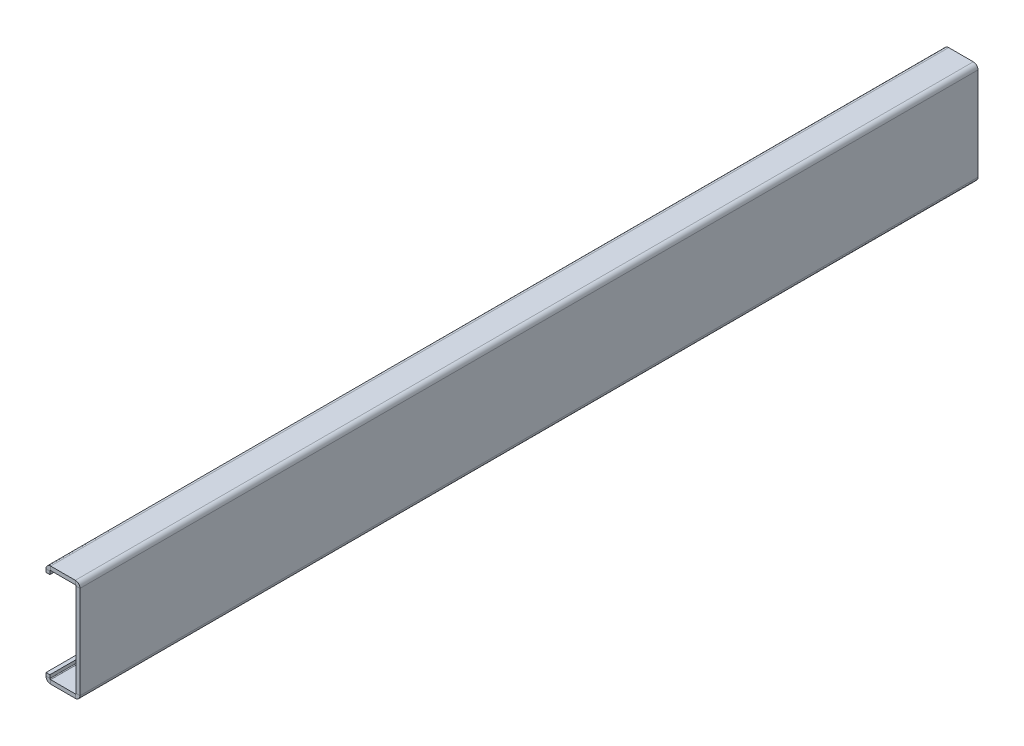
ISO-10303-21;
HEADER;
FILE_DESCRIPTION(('STEP AP214'),'2;1');
FILE_NAME('part.step','',(''),(''),'','','');
FILE_SCHEMA(('AUTOMOTIVE_DESIGN { 1 0 10303 214 1 1 1 1 }'));
ENDSEC;
DATA;
#1=APPLICATION_CONTEXT('core data for automotive mechanical design processes');
#2=APPLICATION_PROTOCOL_DEFINITION('international standard','automotive_design',2000,#1);
#3=PRODUCT_CONTEXT('',#1,'mechanical');
#4=PRODUCT('Part','Part','',(#3));
#5=PRODUCT_RELATED_PRODUCT_CATEGORY('part','',(#4));
#6=PRODUCT_DEFINITION_FORMATION('','',#4);
#7=PRODUCT_DEFINITION_CONTEXT('part definition',#1,'design');
#8=PRODUCT_DEFINITION('design','',#6,#7);
#9=PRODUCT_DEFINITION_SHAPE('','',#8);
#10=(LENGTH_UNIT() NAMED_UNIT(*) SI_UNIT(.MILLI.,.METRE.));
#11=(NAMED_UNIT(*) PLANE_ANGLE_UNIT() SI_UNIT($,.RADIAN.));
#12=(NAMED_UNIT(*) SI_UNIT($,.STERADIAN.) SOLID_ANGLE_UNIT());
#13=UNCERTAINTY_MEASURE_WITH_UNIT(LENGTH_MEASURE(1.E-05),#10,'distance_accuracy_value','');
#14=(GEOMETRIC_REPRESENTATION_CONTEXT(3) GLOBAL_UNCERTAINTY_ASSIGNED_CONTEXT((#13)) GLOBAL_UNIT_ASSIGNED_CONTEXT((#10,
#11,#12)) REPRESENTATION_CONTEXT('',''));
#15=CARTESIAN_POINT('',(0.,0.,0.));
#16=DIRECTION('',(0.,0.,1.));
#17=DIRECTION('',(1.,0.,0.));
#18=AXIS2_PLACEMENT_3D('',#15,#16,#17);
#19=CARTESIAN_POINT('',(-8.7,-11.9,115.));
#20=DIRECTION('',(0.,0.,1.));
#21=DIRECTION('',(1.,0.,0.));
#22=AXIS2_PLACEMENT_3D('',#19,#20,#21);
#23=PLANE('',#22);
#24=DIRECTION('',(1.,0.,0.));
#25=VECTOR('',#24,1.);
#26=CARTESIAN_POINT('',(-8.7,-11.9,115.));
#27=LINE('',#26,#25);
#28=CARTESIAN_POINT('',(-8.7,-11.9,115.));
#29=VERTEX_POINT('',#28);
#30=CARTESIAN_POINT('',(-7.7,-11.9,115.));
#31=VERTEX_POINT('',#30);
#32=EDGE_CURVE('E11',#29,#31,#27,.T.);
#33=ORIENTED_EDGE('',*,*,#32,.F.);
#34=CARTESIAN_POINT('',(-7.5,-11.9,115.));
#35=DIRECTION('',(0.,0.,-1.));
#36=DIRECTION('',(-1.,0.,0.));
#37=AXIS2_PLACEMENT_3D('',#34,#35,#36);
#38=CIRCLE('',#37,1.2);
#39=CARTESIAN_POINT('',(-7.5,-13.1,115.));
#40=VERTEX_POINT('',#39);
#41=EDGE_CURVE('E357',#29,#40,#38,.F.);
#42=ORIENTED_EDGE('',*,*,#41,.T.);
#43=DIRECTION('',(0.,-1.,0.));
#44=VECTOR('',#43,1.);
#45=CARTESIAN_POINT('',(-7.5,-12.1,115.));
#46=LINE('',#45,#44);
#47=CARTESIAN_POINT('',(-7.5,-12.1,115.));
#48=VERTEX_POINT('',#47);
#49=EDGE_CURVE('E40',#48,#40,#46,.T.);
#50=ORIENTED_EDGE('',*,*,#49,.F.);
#51=CARTESIAN_POINT('',(-7.5,-11.9,115.));
#52=DIRECTION('',(0.,0.,1.));
#53=DIRECTION('',(1.,0.,0.));
#54=AXIS2_PLACEMENT_3D('',#51,#52,#53);
#55=CIRCLE('',#54,0.2);
#56=EDGE_CURVE('E432',#31,#48,#55,.T.);
#57=ORIENTED_EDGE('',*,*,#56,.F.);
#58=EDGE_LOOP('',(#33,#42,#50,#57));
#59=FACE_BOUND('',#58,.T.);
#60=ADVANCED_FACE('F32',(#59),#23,.T.);
#61=CARTESIAN_POINT('',(-7.5,-12.1,115.));
#62=DIRECTION('',(0.,0.,1.));
#63=DIRECTION('',(1.,0.,0.));
#64=AXIS2_PLACEMENT_3D('',#61,#62,#63);
#65=PLANE('',#64);
#66=DIRECTION('',(0.,-1.,0.));
#67=VECTOR('',#66,1.);
#68=CARTESIAN_POINT('',(-8.7,-13.1,115.));
#69=LINE('',#68,#67);
#70=CARTESIAN_POINT('',(-8.7,-11.1,115.));
#71=VERTEX_POINT('',#70);
#72=EDGE_CURVE('E361',#71,#29,#69,.T.);
#73=ORIENTED_EDGE('',*,*,#72,.T.);
#74=ORIENTED_EDGE('',*,*,#32,.T.);
#75=DIRECTION('',(0.,-1.,0.));
#76=VECTOR('',#75,1.);
#77=CARTESIAN_POINT('',(-7.7,-13.1,115.));
#78=LINE('',#77,#76);
#79=CARTESIAN_POINT('',(-7.7,-11.1,115.));
#80=VERTEX_POINT('',#79);
#81=EDGE_CURVE('E434',#80,#31,#78,.T.);
#82=ORIENTED_EDGE('',*,*,#81,.F.);
#83=DIRECTION('',(1.,0.,0.));
#84=VECTOR('',#83,1.);
#85=CARTESIAN_POINT('',(-8.7,-11.1,115.));
#86=LINE('',#85,#84);
#87=EDGE_CURVE('E437',#71,#80,#86,.T.);
#88=ORIENTED_EDGE('',*,*,#87,.F.);
#89=EDGE_LOOP('',(#73,#74,#82,#88));
#90=FACE_BOUND('',#89,.T.);
#91=ADVANCED_FACE('F443',(#90),#65,.T.);
#92=CARTESIAN_POINT('',(-7.5,-13.1,-115.));
#93=DIRECTION('',(0.,0.,-1.));
#94=DIRECTION('',(-1.,0.,0.));
#95=AXIS2_PLACEMENT_3D('',#92,#93,#94);
#96=PLANE('',#95);
#97=DIRECTION('',(0.,1.,0.));
#98=VECTOR('',#97,1.);
#99=CARTESIAN_POINT('',(-7.5,-13.1,-115.));
#100=LINE('',#99,#98);
#101=CARTESIAN_POINT('',(-7.5,-13.1,-115.));
#102=VERTEX_POINT('',#101);
#103=CARTESIAN_POINT('',(-7.5,-12.1,-115.));
#104=VERTEX_POINT('',#103);
#105=EDGE_CURVE('E341',#102,#104,#100,.T.);
#106=ORIENTED_EDGE('',*,*,#105,.F.);
#107=CARTESIAN_POINT('',(-7.5,-11.9,-115.));
#108=DIRECTION('',(0.,0.,-1.));
#109=DIRECTION('',(-1.,0.,0.));
#110=AXIS2_PLACEMENT_3D('',#107,#108,#109);
#111=CIRCLE('',#110,1.2);
#112=CARTESIAN_POINT('',(-8.7,-11.9,-115.));
#113=VERTEX_POINT('',#112);
#114=EDGE_CURVE('E257',#113,#102,#111,.F.);
#115=ORIENTED_EDGE('',*,*,#114,.F.);
#116=DIRECTION('',(-1.,0.,0.));
#117=VECTOR('',#116,1.);
#118=CARTESIAN_POINT('',(-7.7,-11.9,-115.));
#119=LINE('',#118,#117);
#120=CARTESIAN_POINT('',(-7.7,-11.9,-115.));
#121=VERTEX_POINT('',#120);
#122=EDGE_CURVE('E339',#121,#113,#119,.T.);
#123=ORIENTED_EDGE('',*,*,#122,.F.);
#124=CARTESIAN_POINT('',(-7.5,-11.9,-115.));
#125=DIRECTION('',(0.,0.,1.));
#126=DIRECTION('',(1.,0.,0.));
#127=AXIS2_PLACEMENT_3D('',#124,#125,#126);
#128=CIRCLE('',#127,0.2);
#129=EDGE_CURVE('E245',#121,#104,#128,.T.);
#130=ORIENTED_EDGE('',*,*,#129,.T.);
#131=EDGE_LOOP('',(#106,#115,#123,#130));
#132=FACE_BOUND('',#131,.T.);
#133=ADVANCED_FACE('F450',(#132),#96,.T.);
#134=CARTESIAN_POINT('',(-7.7,-11.9,-115.));
#135=DIRECTION('',(0.,0.,-1.));
#136=DIRECTION('',(-1.,0.,0.));
#137=AXIS2_PLACEMENT_3D('',#134,#135,#136);
#138=PLANE('',#137);
#139=DIRECTION('',(1.,0.,0.));
#140=VECTOR('',#139,1.);
#141=CARTESIAN_POINT('',(0.,-13.1,-115.));
#142=LINE('',#141,#140);
#143=CARTESIAN_POINT('',(-1.2,-13.1,-115.));
#144=VERTEX_POINT('',#143);
#145=EDGE_CURVE('E260',#102,#144,#142,.T.);
#146=ORIENTED_EDGE('',*,*,#145,.F.);
#147=ORIENTED_EDGE('',*,*,#105,.T.);
#148=DIRECTION('',(1.,0.,0.));
#149=VECTOR('',#148,1.);
#150=CARTESIAN_POINT('',(0.,-12.1,-115.));
#151=LINE('',#150,#149);
#152=CARTESIAN_POINT('',(-1.2,-12.1,-115.));
#153=VERTEX_POINT('',#152);
#154=EDGE_CURVE('E242',#104,#153,#151,.T.);
#155=ORIENTED_EDGE('',*,*,#154,.T.);
#156=DIRECTION('',(0.,-1.,0.));
#157=VECTOR('',#156,1.);
#158=CARTESIAN_POINT('',(-1.2,-12.1,-115.));
#159=LINE('',#158,#157);
#160=EDGE_CURVE('E331',#153,#144,#159,.T.);
#161=ORIENTED_EDGE('',*,*,#160,.T.);
#162=EDGE_LOOP('',(#146,#147,#155,#161));
#163=FACE_BOUND('',#162,.T.);
#164=ADVANCED_FACE('F453',(#163),#138,.T.);
#165=CARTESIAN_POINT('',(-1.2,-13.1,115.));
#166=DIRECTION('',(0.,0.,1.));
#167=DIRECTION('',(1.,0.,0.));
#168=AXIS2_PLACEMENT_3D('',#165,#166,#167);
#169=PLANE('',#168);
#170=DIRECTION('',(0.,1.,0.));
#171=VECTOR('',#170,1.);
#172=CARTESIAN_POINT('',(-1.2,-13.1,115.));
#173=LINE('',#172,#171);
#174=CARTESIAN_POINT('',(-1.2,-13.1,115.));
#175=VERTEX_POINT('',#174);
#176=CARTESIAN_POINT('',(-1.2,-12.1,115.));
#177=VERTEX_POINT('',#176);
#178=EDGE_CURVE('E337',#175,#177,#173,.T.);
#179=ORIENTED_EDGE('',*,*,#178,.F.);
#180=CARTESIAN_POINT('',(-1.2,-11.9,115.));
#181=DIRECTION('',(0.,0.,-1.));
#182=DIRECTION('',(-1.,0.,0.));
#183=AXIS2_PLACEMENT_3D('',#180,#181,#182);
#184=CIRCLE('',#183,1.2);
#185=CARTESIAN_POINT('',(0.,-11.9,115.));
#186=VERTEX_POINT('',#185);
#187=EDGE_CURVE('E369',#175,#186,#184,.F.);
#188=ORIENTED_EDGE('',*,*,#187,.T.);
#189=DIRECTION('',(1.,0.,0.));
#190=VECTOR('',#189,1.);
#191=CARTESIAN_POINT('',(-0.999999999999998,-11.9,115.));
#192=LINE('',#191,#190);
#193=CARTESIAN_POINT('',(-0.999999999999998,-11.9,115.));
#194=VERTEX_POINT('',#193);
#195=EDGE_CURVE('E335',#194,#186,#192,.T.);
#196=ORIENTED_EDGE('',*,*,#195,.F.);
#197=CARTESIAN_POINT('',(-1.2,-11.9,115.));
#198=DIRECTION('',(0.,0.,1.));
#199=DIRECTION('',(1.,0.,0.));
#200=AXIS2_PLACEMENT_3D('',#197,#198,#199);
#201=CIRCLE('',#200,0.2);
#202=EDGE_CURVE('E428',#177,#194,#201,.T.);
#203=ORIENTED_EDGE('',*,*,#202,.F.);
#204=EDGE_LOOP('',(#179,#188,#196,#203));
#205=FACE_BOUND('',#204,.T.);
#206=ADVANCED_FACE('F473',(#205),#169,.T.);
#207=CARTESIAN_POINT('',(-0.999999999999998,-11.9,115.));
#208=DIRECTION('',(0.,0.,1.));
#209=DIRECTION('',(1.,0.,0.));
#210=AXIS2_PLACEMENT_3D('',#207,#208,#209);
#211=PLANE('',#210);
#212=DIRECTION('',(1.,0.,0.));
#213=VECTOR('',#212,1.);
#214=CARTESIAN_POINT('',(0.,-13.1,115.));
#215=LINE('',#214,#213);
#216=EDGE_CURVE('E348',#40,#175,#215,.T.);
#217=ORIENTED_EDGE('',*,*,#216,.T.);
#218=ORIENTED_EDGE('',*,*,#178,.T.);
#219=DIRECTION('',(1.,0.,0.));
#220=VECTOR('',#219,1.);
#221=CARTESIAN_POINT('',(0.,-12.1,115.));
#222=LINE('',#221,#220);
#223=EDGE_CURVE('E351',#48,#177,#222,.T.);
#224=ORIENTED_EDGE('',*,*,#223,.F.);
#225=ORIENTED_EDGE('',*,*,#49,.T.);
#226=EDGE_LOOP('',(#217,#218,#224,#225));
#227=FACE_BOUND('',#226,.T.);
#228=ADVANCED_FACE('F346',(#227),#211,.T.);
#229=CARTESIAN_POINT('',(0.,-11.9,-115.));
#230=DIRECTION('',(0.,0.,-1.));
#231=DIRECTION('',(-1.,0.,0.));
#232=AXIS2_PLACEMENT_3D('',#229,#230,#231);
#233=PLANE('',#232);
#234=DIRECTION('',(-1.,0.,0.));
#235=VECTOR('',#234,1.);
#236=CARTESIAN_POINT('',(0.,-11.9,-115.));
#237=LINE('',#236,#235);
#238=CARTESIAN_POINT('',(0.,-11.9,-115.));
#239=VERTEX_POINT('',#238);
#240=CARTESIAN_POINT('',(-0.999999999999998,-11.9,-115.));
#241=VERTEX_POINT('',#240);
#242=EDGE_CURVE('E333',#239,#241,#237,.T.);
#243=ORIENTED_EDGE('',*,*,#242,.F.);
#244=CARTESIAN_POINT('',(-1.2,-11.9,-115.));
#245=DIRECTION('',(0.,0.,-1.));
#246=DIRECTION('',(-1.,0.,0.));
#247=AXIS2_PLACEMENT_3D('',#244,#245,#246);
#248=CIRCLE('',#247,1.2);
#249=EDGE_CURVE('E263',#144,#239,#248,.F.);
#250=ORIENTED_EDGE('',*,*,#249,.F.);
#251=ORIENTED_EDGE('',*,*,#160,.F.);
#252=CARTESIAN_POINT('',(-1.2,-11.9,-115.));
#253=DIRECTION('',(0.,0.,1.));
#254=DIRECTION('',(1.,0.,0.));
#255=AXIS2_PLACEMENT_3D('',#252,#253,#254);
#256=CIRCLE('',#255,0.2);
#257=EDGE_CURVE('E239',#153,#241,#256,.T.);
#258=ORIENTED_EDGE('',*,*,#257,.T.);
#259=EDGE_LOOP('',(#243,#250,#251,#258));
#260=FACE_BOUND('',#259,.T.);
#261=ADVANCED_FACE('F467',(#260),#233,.T.);
#262=CARTESIAN_POINT('',(-1.2,-12.1,-115.));
#263=DIRECTION('',(0.,0.,-1.));
#264=DIRECTION('',(-1.,0.,0.));
#265=AXIS2_PLACEMENT_3D('',#262,#263,#264);
#266=PLANE('',#265);
#267=DIRECTION('',(0.,1.,0.));
#268=VECTOR('',#267,1.);
#269=CARTESIAN_POINT('',(0.,13.1,-115.));
#270=LINE('',#269,#268);
#271=CARTESIAN_POINT('',(0.,11.9,-115.));
#272=VERTEX_POINT('',#271);
#273=EDGE_CURVE('E266',#239,#272,#270,.T.);
#274=ORIENTED_EDGE('',*,*,#273,.F.);
#275=ORIENTED_EDGE('',*,*,#242,.T.);
#276=DIRECTION('',(0.,1.,0.));
#277=VECTOR('',#276,1.);
#278=CARTESIAN_POINT('',(-1.,13.1,-115.));
#279=LINE('',#278,#277);
#280=CARTESIAN_POINT('',(-1.,11.9,-115.));
#281=VERTEX_POINT('',#280);
#282=EDGE_CURVE('E236',#241,#281,#279,.T.);
#283=ORIENTED_EDGE('',*,*,#282,.T.);
#284=DIRECTION('',(1.,0.,0.));
#285=VECTOR('',#284,1.);
#286=CARTESIAN_POINT('',(-1.,11.9,-115.));
#287=LINE('',#286,#285);
#288=EDGE_CURVE('E327',#281,#272,#287,.T.);
#289=ORIENTED_EDGE('',*,*,#288,.T.);
#290=EDGE_LOOP('',(#274,#275,#283,#289));
#291=FACE_BOUND('',#290,.T.);
#292=ADVANCED_FACE('F477',(#291),#266,.T.);
#293=CARTESIAN_POINT('',(0.,11.9,115.));
#294=DIRECTION('',(0.,0.,1.));
#295=DIRECTION('',(1.,0.,0.));
#296=AXIS2_PLACEMENT_3D('',#293,#294,#295);
#297=PLANE('',#296);
#298=DIRECTION('',(-1.,0.,0.));
#299=VECTOR('',#298,1.);
#300=CARTESIAN_POINT('',(0.,11.9,115.));
#301=LINE('',#300,#299);
#302=CARTESIAN_POINT('',(0.,11.9,115.));
#303=VERTEX_POINT('',#302);
#304=CARTESIAN_POINT('',(-1.,11.9,115.));
#305=VERTEX_POINT('',#304);
#306=EDGE_CURVE('E189',#303,#305,#301,.T.);
#307=ORIENTED_EDGE('',*,*,#306,.F.);
#308=CARTESIAN_POINT('',(-1.2,11.9,115.));
#309=DIRECTION('',(0.,0.,-1.));
#310=DIRECTION('',(-1.,0.,0.));
#311=AXIS2_PLACEMENT_3D('',#308,#309,#310);
#312=CIRCLE('',#311,1.2);
#313=CARTESIAN_POINT('',(-1.2,13.1,115.));
#314=VERTEX_POINT('',#313);
#315=EDGE_CURVE('E193',#303,#314,#312,.F.);
#316=ORIENTED_EDGE('',*,*,#315,.T.);
#317=DIRECTION('',(0.,1.,0.));
#318=VECTOR('',#317,1.);
#319=CARTESIAN_POINT('',(-1.2,12.1,115.));
#320=LINE('',#319,#318);
#321=CARTESIAN_POINT('',(-1.2,12.1,115.));
#322=VERTEX_POINT('',#321);
#323=EDGE_CURVE('E177',#322,#314,#320,.T.);
#324=ORIENTED_EDGE('',*,*,#323,.F.);
#325=CARTESIAN_POINT('',(-1.2,11.9,115.));
#326=DIRECTION('',(0.,0.,1.));
#327=DIRECTION('',(1.,0.,0.));
#328=AXIS2_PLACEMENT_3D('',#325,#326,#327);
#329=CIRCLE('',#328,0.2);
#330=EDGE_CURVE('E390',#305,#322,#329,.T.);
#331=ORIENTED_EDGE('',*,*,#330,.F.);
#332=EDGE_LOOP('',(#307,#316,#324,#331));
#333=FACE_BOUND('',#332,.T.);
#334=ADVANCED_FACE('F195',(#333),#297,.T.);
#335=CARTESIAN_POINT('',(-1.2,12.1,115.));
#336=DIRECTION('',(0.,0.,1.));
#337=DIRECTION('',(1.,0.,0.));
#338=AXIS2_PLACEMENT_3D('',#335,#336,#337);
#339=PLANE('',#338);
#340=DIRECTION('',(0.,1.,0.));
#341=VECTOR('',#340,1.);
#342=CARTESIAN_POINT('',(0.,13.1,115.));
#343=LINE('',#342,#341);
#344=EDGE_CURVE('E199',#186,#303,#343,.T.);
#345=ORIENTED_EDGE('',*,*,#344,.T.);
#346=ORIENTED_EDGE('',*,*,#306,.T.);
#347=DIRECTION('',(0.,1.,0.));
#348=VECTOR('',#347,1.);
#349=CARTESIAN_POINT('',(-1.,13.1,115.));
#350=LINE('',#349,#348);
#351=EDGE_CURVE('E425',#194,#305,#350,.T.);
#352=ORIENTED_EDGE('',*,*,#351,.F.);
#353=ORIENTED_EDGE('',*,*,#195,.T.);
#354=EDGE_LOOP('',(#345,#346,#352,#353));
#355=FACE_BOUND('',#354,.T.);
#356=ADVANCED_FACE('F377',(#355),#339,.T.);
#357=CARTESIAN_POINT('',(-1.2,13.1,-115.));
#358=DIRECTION('',(0.,0.,-1.));
#359=DIRECTION('',(-1.,0.,0.));
#360=AXIS2_PLACEMENT_3D('',#357,#358,#359);
#361=PLANE('',#360);
#362=DIRECTION('',(0.,-1.,0.));
#363=VECTOR('',#362,1.);
#364=CARTESIAN_POINT('',(-1.2,13.1,-115.));
#365=LINE('',#364,#363);
#366=CARTESIAN_POINT('',(-1.2,13.1,-115.));
#367=VERTEX_POINT('',#366);
#368=CARTESIAN_POINT('',(-1.2,12.1,-115.));
#369=VERTEX_POINT('',#368);
#370=EDGE_CURVE('E190',#367,#369,#365,.T.);
#371=ORIENTED_EDGE('',*,*,#370,.F.);
#372=CARTESIAN_POINT('',(-1.2,11.9,-115.));
#373=DIRECTION('',(0.,0.,-1.));
#374=DIRECTION('',(-1.,0.,0.));
#375=AXIS2_PLACEMENT_3D('',#372,#373,#374);
#376=CIRCLE('',#375,1.2);
#377=EDGE_CURVE('E206',#272,#367,#376,.F.);
#378=ORIENTED_EDGE('',*,*,#377,.F.);
#379=ORIENTED_EDGE('',*,*,#288,.F.);
#380=CARTESIAN_POINT('',(-1.2,11.9,-115.));
#381=DIRECTION('',(0.,0.,1.));
#382=DIRECTION('',(1.,0.,0.));
#383=AXIS2_PLACEMENT_3D('',#380,#381,#382);
#384=CIRCLE('',#383,0.2);
#385=EDGE_CURVE('E233',#281,#369,#384,.T.);
#386=ORIENTED_EDGE('',*,*,#385,.T.);
#387=EDGE_LOOP('',(#371,#378,#379,#386));
#388=FACE_BOUND('',#387,.T.);
#389=ADVANCED_FACE('F384',(#388),#361,.T.);
#390=CARTESIAN_POINT('',(-1.,11.9,-115.));
#391=DIRECTION('',(0.,0.,-1.));
#392=DIRECTION('',(-1.,0.,0.));
#393=AXIS2_PLACEMENT_3D('',#390,#391,#392);
#394=PLANE('',#393);
#395=DIRECTION('',(-1.,0.,0.));
#396=VECTOR('',#395,1.);
#397=CARTESIAN_POINT('',(-8.7,13.1,-115.));
#398=LINE('',#397,#396);
#399=CARTESIAN_POINT('',(-7.5,13.1,-115.));
#400=VERTEX_POINT('',#399);
#401=EDGE_CURVE('E270',#367,#400,#398,.T.);
#402=ORIENTED_EDGE('',*,*,#401,.F.);
#403=ORIENTED_EDGE('',*,*,#370,.T.);
#404=DIRECTION('',(1.,0.,0.));
#405=VECTOR('',#404,1.);
#406=CARTESIAN_POINT('',(-8.7,12.1,-115.));
#407=LINE('',#406,#405);
#408=CARTESIAN_POINT('',(-7.5,12.1,-115.));
#409=VERTEX_POINT('',#408);
#410=EDGE_CURVE('E231',#369,#409,#407,.F.);
#411=ORIENTED_EDGE('',*,*,#410,.T.);
#412=DIRECTION('',(0.,1.,0.));
#413=VECTOR('',#412,1.);
#414=CARTESIAN_POINT('',(-7.5,12.1,-115.));
#415=LINE('',#414,#413);
#416=EDGE_CURVE('E113',#409,#400,#415,.T.);
#417=ORIENTED_EDGE('',*,*,#416,.T.);
#418=EDGE_LOOP('',(#402,#403,#411,#417));
#419=FACE_BOUND('',#418,.T.);
#420=ADVANCED_FACE('F386',(#419),#394,.T.);
#421=CARTESIAN_POINT('',(-7.5,13.1,115.));
#422=DIRECTION('',(0.,0.,1.));
#423=DIRECTION('',(1.,0.,0.));
#424=AXIS2_PLACEMENT_3D('',#421,#422,#423);
#425=PLANE('',#424);
#426=DIRECTION('',(0.,-1.,0.));
#427=VECTOR('',#426,1.);
#428=CARTESIAN_POINT('',(-7.5,13.1,115.));
#429=LINE('',#428,#427);
#430=CARTESIAN_POINT('',(-7.5,13.1,115.));
#431=VERTEX_POINT('',#430);
#432=CARTESIAN_POINT('',(-7.5,12.1,115.));
#433=VERTEX_POINT('',#432);
#434=EDGE_CURVE('E325',#431,#433,#429,.T.);
#435=ORIENTED_EDGE('',*,*,#434,.F.);
#436=CARTESIAN_POINT('',(-7.5,11.9,115.));
#437=DIRECTION('',(0.,0.,-1.));
#438=DIRECTION('',(-1.,0.,0.));
#439=AXIS2_PLACEMENT_3D('',#436,#437,#438);
#440=CIRCLE('',#439,1.2);
#441=CARTESIAN_POINT('',(-8.7,11.9,115.));
#442=VERTEX_POINT('',#441);
#443=EDGE_CURVE('E214',#431,#442,#440,.F.);
#444=ORIENTED_EDGE('',*,*,#443,.T.);
#445=DIRECTION('',(-1.,0.,0.));
#446=VECTOR('',#445,1.);
#447=CARTESIAN_POINT('',(-7.7,11.9,115.));
#448=LINE('',#447,#446);
#449=CARTESIAN_POINT('',(-7.7,11.9,115.));
#450=VERTEX_POINT('',#449);
#451=EDGE_CURVE('E48',#450,#442,#448,.T.);
#452=ORIENTED_EDGE('',*,*,#451,.F.);
#453=CARTESIAN_POINT('',(-7.5,11.9,115.));
#454=DIRECTION('',(0.,0.,1.));
#455=DIRECTION('',(1.,0.,0.));
#456=AXIS2_PLACEMENT_3D('',#453,#454,#455);
#457=CIRCLE('',#456,0.2);
#458=EDGE_CURVE('E418',#433,#450,#457,.T.);
#459=ORIENTED_EDGE('',*,*,#458,.F.);
#460=EDGE_LOOP('',(#435,#444,#452,#459));
#461=FACE_BOUND('',#460,.T.);
#462=ADVANCED_FACE('F548',(#461),#425,.T.);
#463=CARTESIAN_POINT('',(-7.7,11.9,115.));
#464=DIRECTION('',(0.,0.,1.));
#465=DIRECTION('',(1.,0.,0.));
#466=AXIS2_PLACEMENT_3D('',#463,#464,#465);
#467=PLANE('',#466);
#468=DIRECTION('',(-1.,0.,0.));
#469=VECTOR('',#468,1.);
#470=CARTESIAN_POINT('',(-8.7,13.1,115.));
#471=LINE('',#470,#469);
#472=EDGE_CURVE('E181',#314,#431,#471,.T.);
#473=ORIENTED_EDGE('',*,*,#472,.T.);
#474=ORIENTED_EDGE('',*,*,#434,.T.);
#475=DIRECTION('',(1.,0.,0.));
#476=VECTOR('',#475,1.);
#477=CARTESIAN_POINT('',(-8.7,12.1,115.));
#478=LINE('',#477,#476);
#479=EDGE_CURVE('E184',#322,#433,#478,.F.);
#480=ORIENTED_EDGE('',*,*,#479,.F.);
#481=ORIENTED_EDGE('',*,*,#323,.T.);
#482=EDGE_LOOP('',(#473,#474,#480,#481));
#483=FACE_BOUND('',#482,.T.);
#484=ADVANCED_FACE('F179',(#483),#467,.T.);
#485=CARTESIAN_POINT('',(-8.7,11.9,-115.));
#486=DIRECTION('',(0.,0.,-1.));
#487=DIRECTION('',(-1.,0.,0.));
#488=AXIS2_PLACEMENT_3D('',#485,#486,#487);
#489=PLANE('',#488);
#490=DIRECTION('',(1.,0.,0.));
#491=VECTOR('',#490,1.);
#492=CARTESIAN_POINT('',(-8.7,11.9,-115.));
#493=LINE('',#492,#491);
#494=CARTESIAN_POINT('',(-8.7,11.9,-115.));
#495=VERTEX_POINT('',#494);
#496=CARTESIAN_POINT('',(-7.7,11.9,-115.));
#497=VERTEX_POINT('',#496);
#498=EDGE_CURVE('E120',#495,#497,#493,.T.);
#499=ORIENTED_EDGE('',*,*,#498,.F.);
#500=CARTESIAN_POINT('',(-7.5,11.9,-115.));
#501=DIRECTION('',(0.,0.,-1.));
#502=DIRECTION('',(-1.,0.,0.));
#503=AXIS2_PLACEMENT_3D('',#500,#501,#502);
#504=CIRCLE('',#503,1.2);
#505=EDGE_CURVE('E272',#400,#495,#504,.F.);
#506=ORIENTED_EDGE('',*,*,#505,.F.);
#507=ORIENTED_EDGE('',*,*,#416,.F.);
#508=CARTESIAN_POINT('',(-7.5,11.9,-115.));
#509=DIRECTION('',(0.,0.,1.));
#510=DIRECTION('',(1.,0.,0.));
#511=AXIS2_PLACEMENT_3D('',#508,#509,#510);
#512=CIRCLE('',#511,0.2);
#513=EDGE_CURVE('E229',#409,#497,#512,.T.);
#514=ORIENTED_EDGE('',*,*,#513,.T.);
#515=EDGE_LOOP('',(#499,#506,#507,#514));
#516=FACE_BOUND('',#515,.T.);
#517=ADVANCED_FACE('F401',(#516),#489,.T.);
#518=CARTESIAN_POINT('',(-7.5,12.1,-115.));
#519=DIRECTION('',(0.,0.,-1.));
#520=DIRECTION('',(-1.,0.,0.));
#521=AXIS2_PLACEMENT_3D('',#518,#519,#520);
#522=PLANE('',#521);
#523=DIRECTION('',(0.,-1.,0.));
#524=VECTOR('',#523,1.);
#525=CARTESIAN_POINT('',(-8.7,13.1,-115.));
#526=LINE('',#525,#524);
#527=CARTESIAN_POINT('',(-8.7,11.1,-115.));
#528=VERTEX_POINT('',#527);
#529=EDGE_CURVE('E220',#495,#528,#526,.T.);
#530=ORIENTED_EDGE('',*,*,#529,.F.);
#531=ORIENTED_EDGE('',*,*,#498,.T.);
#532=DIRECTION('',(0.,-1.,0.));
#533=VECTOR('',#532,1.);
#534=CARTESIAN_POINT('',(-7.7,13.1,-115.));
#535=LINE('',#534,#533);
#536=CARTESIAN_POINT('',(-7.7,11.1,-115.));
#537=VERTEX_POINT('',#536);
#538=EDGE_CURVE('E226',#497,#537,#535,.T.);
#539=ORIENTED_EDGE('',*,*,#538,.T.);
#540=DIRECTION('',(-1.,0.,0.));
#541=VECTOR('',#540,1.);
#542=CARTESIAN_POINT('',(-7.7,11.1,-115.));
#543=LINE('',#542,#541);
#544=EDGE_CURVE('E223',#537,#528,#543,.T.);
#545=ORIENTED_EDGE('',*,*,#544,.T.);
#546=EDGE_LOOP('',(#530,#531,#539,#545));
#547=FACE_BOUND('',#546,.T.);
#548=ADVANCED_FACE('F409',(#547),#522,.T.);
#549=CARTESIAN_POINT('',(-8.7,13.1,115.));
#550=DIRECTION('',(1.,0.,0.));
#551=DIRECTION('',(0.,1.,0.));
#552=AXIS2_PLACEMENT_3D('',#549,#550,#551);
#553=PLANE('',#552);
#554=ORIENTED_EDGE('',*,*,#529,.T.);
#555=DIRECTION('',(0.,0.,-1.));
#556=VECTOR('',#555,1.);
#557=CARTESIAN_POINT('',(-8.7,11.1,115.));
#558=LINE('',#557,#556);
#559=CARTESIAN_POINT('',(-8.7,11.1,115.));
#560=VERTEX_POINT('',#559);
#561=EDGE_CURVE('E320',#560,#528,#558,.T.);
#562=ORIENTED_EDGE('',*,*,#561,.F.);
#563=DIRECTION('',(0.,-1.,0.));
#564=VECTOR('',#563,1.);
#565=CARTESIAN_POINT('',(-8.7,13.1,115.));
#566=LINE('',#565,#564);
#567=EDGE_CURVE('E126',#442,#560,#566,.T.);
#568=ORIENTED_EDGE('',*,*,#567,.F.);
#569=DIRECTION('',(0.,0.,-1.));
#570=VECTOR('',#569,1.);
#571=CARTESIAN_POINT('',(-8.7,11.9,115.));
#572=LINE('',#571,#570);
#573=EDGE_CURVE('E216',#442,#495,#572,.T.);
#574=ORIENTED_EDGE('',*,*,#573,.T.);
#575=EDGE_LOOP('',(#554,#562,#568,#574));
#576=FACE_BOUND('',#575,.T.);
#577=ADVANCED_FACE('F407',(#576),#553,.F.);
#578=CARTESIAN_POINT('',(-7.7,11.1,115.));
#579=DIRECTION('',(0.,-1.,0.));
#580=DIRECTION('',(0.,0.,-1.));
#581=AXIS2_PLACEMENT_3D('',#578,#579,#580);
#582=PLANE('',#581);
#583=ORIENTED_EDGE('',*,*,#544,.F.);
#584=DIRECTION('',(0.,0.,-1.));
#585=VECTOR('',#584,1.);
#586=CARTESIAN_POINT('',(-7.7,11.1,115.));
#587=LINE('',#586,#585);
#588=CARTESIAN_POINT('',(-7.7,11.1,115.));
#589=VERTEX_POINT('',#588);
#590=EDGE_CURVE('E318',#589,#537,#587,.T.);
#591=ORIENTED_EDGE('',*,*,#590,.F.);
#592=DIRECTION('',(-1.,0.,0.));
#593=VECTOR('',#592,1.);
#594=CARTESIAN_POINT('',(-7.7,11.1,115.));
#595=LINE('',#594,#593);
#596=EDGE_CURVE('E414',#589,#560,#595,.T.);
#597=ORIENTED_EDGE('',*,*,#596,.T.);
#598=ORIENTED_EDGE('',*,*,#561,.T.);
#599=EDGE_LOOP('',(#583,#591,#597,#598));
#600=FACE_BOUND('',#599,.T.);
#601=ADVANCED_FACE('F412',(#600),#582,.T.);
#602=CARTESIAN_POINT('',(-7.7,13.1,115.));
#603=DIRECTION('',(1.,0.,0.));
#604=DIRECTION('',(0.,1.,0.));
#605=AXIS2_PLACEMENT_3D('',#602,#603,#604);
#606=PLANE('',#605);
#607=ORIENTED_EDGE('',*,*,#538,.F.);
#608=DIRECTION('',(0.,0.,-1.));
#609=VECTOR('',#608,1.);
#610=CARTESIAN_POINT('',(-7.7,11.9,115.));
#611=LINE('',#610,#609);
#612=EDGE_CURVE('E315',#450,#497,#611,.T.);
#613=ORIENTED_EDGE('',*,*,#612,.F.);
#614=DIRECTION('',(0.,-1.,0.));
#615=VECTOR('',#614,1.);
#616=CARTESIAN_POINT('',(-7.7,13.1,115.));
#617=LINE('',#616,#615);
#618=EDGE_CURVE('E416',#450,#589,#617,.T.);
#619=ORIENTED_EDGE('',*,*,#618,.T.);
#620=ORIENTED_EDGE('',*,*,#590,.T.);
#621=EDGE_LOOP('',(#607,#613,#619,#620));
#622=FACE_BOUND('',#621,.T.);
#623=ADVANCED_FACE('F604',(#622),#606,.T.);
#624=CARTESIAN_POINT('',(-7.5,11.9,115.));
#625=DIRECTION('',(0.,0.,-1.));
#626=DIRECTION('',(-1.,0.,0.));
#627=AXIS2_PLACEMENT_3D('',#624,#625,#626);
#628=CYLINDRICAL_SURFACE('',#627,0.2);
#629=ORIENTED_EDGE('',*,*,#513,.F.);
#630=DIRECTION('',(0.,0.,-1.));
#631=VECTOR('',#630,1.);
#632=CARTESIAN_POINT('',(-7.5,12.1,115.));
#633=LINE('',#632,#631);
#634=EDGE_CURVE('E312',#433,#409,#633,.T.);
#635=ORIENTED_EDGE('',*,*,#634,.F.);
#636=ORIENTED_EDGE('',*,*,#458,.T.);
#637=ORIENTED_EDGE('',*,*,#612,.T.);
#638=EDGE_LOOP('',(#629,#635,#636,#637));
#639=FACE_BOUND('',#638,.T.);
#640=ADVANCED_FACE('F398',(#639),#628,.F.);
#641=CARTESIAN_POINT('',(-8.7,12.1,115.));
#642=DIRECTION('',(0.,-1.,0.));
#643=DIRECTION('',(0.,0.,-1.));
#644=AXIS2_PLACEMENT_3D('',#641,#642,#643);
#645=PLANE('',#644);
#646=ORIENTED_EDGE('',*,*,#410,.F.);
#647=DIRECTION('',(0.,0.,-1.));
#648=VECTOR('',#647,1.);
#649=CARTESIAN_POINT('',(-1.2,12.1,115.));
#650=LINE('',#649,#648);
#651=EDGE_CURVE('E309',#322,#369,#650,.T.);
#652=ORIENTED_EDGE('',*,*,#651,.F.);
#653=ORIENTED_EDGE('',*,*,#479,.T.);
#654=ORIENTED_EDGE('',*,*,#634,.T.);
#655=EDGE_LOOP('',(#646,#652,#653,#654));
#656=FACE_BOUND('',#655,.T.);
#657=ADVANCED_FACE('F392',(#656),#645,.T.);
#658=CARTESIAN_POINT('',(-1.2,11.9,115.));
#659=DIRECTION('',(0.,0.,-1.));
#660=DIRECTION('',(-1.,0.,0.));
#661=AXIS2_PLACEMENT_3D('',#658,#659,#660);
#662=CYLINDRICAL_SURFACE('',#661,0.2);
#663=ORIENTED_EDGE('',*,*,#385,.F.);
#664=DIRECTION('',(0.,0.,-1.));
#665=VECTOR('',#664,1.);
#666=CARTESIAN_POINT('',(-1.,11.9,115.));
#667=LINE('',#666,#665);
#668=EDGE_CURVE('E306',#305,#281,#667,.T.);
#669=ORIENTED_EDGE('',*,*,#668,.F.);
#670=ORIENTED_EDGE('',*,*,#330,.T.);
#671=ORIENTED_EDGE('',*,*,#651,.T.);
#672=EDGE_LOOP('',(#663,#669,#670,#671));
#673=FACE_BOUND('',#672,.T.);
#674=ADVANCED_FACE('F389',(#673),#662,.F.);
#675=CARTESIAN_POINT('',(-1.,13.1,115.));
#676=DIRECTION('',(-1.,0.,0.));
#677=DIRECTION('',(0.,-1.,0.));
#678=AXIS2_PLACEMENT_3D('',#675,#676,#677);
#679=PLANE('',#678);
#680=ORIENTED_EDGE('',*,*,#282,.F.);
#681=DIRECTION('',(0.,0.,-1.));
#682=VECTOR('',#681,1.);
#683=CARTESIAN_POINT('',(-0.999999999999998,-11.9,115.));
#684=LINE('',#683,#682);
#685=EDGE_CURVE('E303',#194,#241,#684,.T.);
#686=ORIENTED_EDGE('',*,*,#685,.F.);
#687=ORIENTED_EDGE('',*,*,#351,.T.);
#688=ORIENTED_EDGE('',*,*,#668,.T.);
#689=EDGE_LOOP('',(#680,#686,#687,#688));
#690=FACE_BOUND('',#689,.T.);
#691=ADVANCED_FACE('F475',(#690),#679,.T.);
#692=CARTESIAN_POINT('',(-1.2,-11.9,115.));
#693=DIRECTION('',(0.,0.,-1.));
#694=DIRECTION('',(-1.,0.,0.));
#695=AXIS2_PLACEMENT_3D('',#692,#693,#694);
#696=CYLINDRICAL_SURFACE('',#695,0.2);
#697=ORIENTED_EDGE('',*,*,#257,.F.);
#698=DIRECTION('',(0.,0.,-1.));
#699=VECTOR('',#698,1.);
#700=CARTESIAN_POINT('',(-1.2,-12.1,115.));
#701=LINE('',#700,#699);
#702=EDGE_CURVE('E300',#177,#153,#701,.T.);
#703=ORIENTED_EDGE('',*,*,#702,.F.);
#704=ORIENTED_EDGE('',*,*,#202,.T.);
#705=ORIENTED_EDGE('',*,*,#685,.T.);
#706=EDGE_LOOP('',(#697,#703,#704,#705));
#707=FACE_BOUND('',#706,.T.);
#708=ADVANCED_FACE('F463',(#707),#696,.F.);
#709=CARTESIAN_POINT('',(0.,-12.1,115.));
#710=DIRECTION('',(0.,1.,0.));
#711=DIRECTION('',(-1.,0.,0.));
#712=AXIS2_PLACEMENT_3D('',#709,#710,#711);
#713=PLANE('',#712);
#714=ORIENTED_EDGE('',*,*,#154,.F.);
#715=DIRECTION('',(0.,0.,-1.));
#716=VECTOR('',#715,1.);
#717=CARTESIAN_POINT('',(-7.5,-12.1,115.));
#718=LINE('',#717,#716);
#719=EDGE_CURVE('E297',#48,#104,#718,.T.);
#720=ORIENTED_EDGE('',*,*,#719,.F.);
#721=ORIENTED_EDGE('',*,*,#223,.T.);
#722=ORIENTED_EDGE('',*,*,#702,.T.);
#723=EDGE_LOOP('',(#714,#720,#721,#722));
#724=FACE_BOUND('',#723,.T.);
#725=ADVANCED_FACE('F458',(#724),#713,.T.);
#726=CARTESIAN_POINT('',(-7.5,-11.9,115.));
#727=DIRECTION('',(0.,0.,-1.));
#728=DIRECTION('',(-1.,0.,0.));
#729=AXIS2_PLACEMENT_3D('',#726,#727,#728);
#730=CYLINDRICAL_SURFACE('',#729,0.2);
#731=ORIENTED_EDGE('',*,*,#129,.F.);
#732=DIRECTION('',(0.,0.,-1.));
#733=VECTOR('',#732,1.);
#734=CARTESIAN_POINT('',(-7.7,-11.9,115.));
#735=LINE('',#734,#733);
#736=EDGE_CURVE('E294',#31,#121,#735,.T.);
#737=ORIENTED_EDGE('',*,*,#736,.F.);
#738=ORIENTED_EDGE('',*,*,#56,.T.);
#739=ORIENTED_EDGE('',*,*,#719,.T.);
#740=EDGE_LOOP('',(#731,#737,#738,#739));
#741=FACE_BOUND('',#740,.T.);
#742=ADVANCED_FACE('F456',(#741),#730,.F.);
#743=CARTESIAN_POINT('',(-7.7,-13.1,115.));
#744=DIRECTION('',(1.,0.,0.));
#745=DIRECTION('',(0.,1.,0.));
#746=AXIS2_PLACEMENT_3D('',#743,#744,#745);
#747=PLANE('',#746);
#748=DIRECTION('',(0.,-1.,0.));
#749=VECTOR('',#748,1.);
#750=CARTESIAN_POINT('',(-7.7,-13.1,-115.));
#751=LINE('',#750,#749);
#752=CARTESIAN_POINT('',(-7.7,-11.1,-115.));
#753=VERTEX_POINT('',#752);
#754=EDGE_CURVE('E248',#753,#121,#751,.T.);
#755=ORIENTED_EDGE('',*,*,#754,.F.);
#756=DIRECTION('',(0.,0.,-1.));
#757=VECTOR('',#756,1.);
#758=CARTESIAN_POINT('',(-7.7,-11.1,115.));
#759=LINE('',#758,#757);
#760=EDGE_CURVE('E292',#80,#753,#759,.T.);
#761=ORIENTED_EDGE('',*,*,#760,.F.);
#762=ORIENTED_EDGE('',*,*,#81,.T.);
#763=ORIENTED_EDGE('',*,*,#736,.T.);
#764=EDGE_LOOP('',(#755,#761,#762,#763));
#765=FACE_BOUND('',#764,.T.);
#766=ADVANCED_FACE('F678',(#765),#747,.T.);
#767=CARTESIAN_POINT('',(-8.7,-11.1,115.));
#768=DIRECTION('',(0.,1.,0.));
#769=DIRECTION('',(0.,0.,1.));
#770=AXIS2_PLACEMENT_3D('',#767,#768,#769);
#771=PLANE('',#770);
#772=DIRECTION('',(1.,0.,0.));
#773=VECTOR('',#772,1.);
#774=CARTESIAN_POINT('',(-8.7,-11.1,-115.));
#775=LINE('',#774,#773);
#776=CARTESIAN_POINT('',(-8.7,-11.1,-115.));
#777=VERTEX_POINT('',#776);
#778=EDGE_CURVE('E251',#777,#753,#775,.T.);
#779=ORIENTED_EDGE('',*,*,#778,.F.);
#780=DIRECTION('',(0.,0.,-1.));
#781=VECTOR('',#780,1.);
#782=CARTESIAN_POINT('',(-8.7,-11.1,115.));
#783=LINE('',#782,#781);
#784=EDGE_CURVE('E290',#71,#777,#783,.T.);
#785=ORIENTED_EDGE('',*,*,#784,.F.);
#786=ORIENTED_EDGE('',*,*,#87,.T.);
#787=ORIENTED_EDGE('',*,*,#760,.T.);
#788=EDGE_LOOP('',(#779,#785,#786,#787));
#789=FACE_BOUND('',#788,.T.);
#790=ADVANCED_FACE('F688',(#789),#771,.T.);
#791=CARTESIAN_POINT('',(-8.7,-13.1,115.));
#792=DIRECTION('',(1.,0.,0.));
#793=DIRECTION('',(0.,1.,0.));
#794=AXIS2_PLACEMENT_3D('',#791,#792,#793);
#795=PLANE('',#794);
#796=DIRECTION('',(0.,-1.,0.));
#797=VECTOR('',#796,1.);
#798=CARTESIAN_POINT('',(-8.7,-13.1,-115.));
#799=LINE('',#798,#797);
#800=EDGE_CURVE('E254',#777,#113,#799,.T.);
#801=ORIENTED_EDGE('',*,*,#800,.T.);
#802=DIRECTION('',(0.,0.,-1.));
#803=VECTOR('',#802,1.);
#804=CARTESIAN_POINT('',(-8.7,-11.9,115.));
#805=LINE('',#804,#803);
#806=EDGE_CURVE('E287',#29,#113,#805,.T.);
#807=ORIENTED_EDGE('',*,*,#806,.F.);
#808=ORIENTED_EDGE('',*,*,#72,.F.);
#809=ORIENTED_EDGE('',*,*,#784,.T.);
#810=EDGE_LOOP('',(#801,#807,#808,#809));
#811=FACE_BOUND('',#810,.T.);
#812=ADVANCED_FACE('F447',(#811),#795,.F.);
#813=CARTESIAN_POINT('',(-7.5,-11.9,115.));
#814=DIRECTION('',(0.,0.,-1.));
#815=DIRECTION('',(-1.,0.,0.));
#816=AXIS2_PLACEMENT_3D('',#813,#814,#815);
#817=CYLINDRICAL_SURFACE('',#816,1.2);
#818=ORIENTED_EDGE('',*,*,#114,.T.);
#819=DIRECTION('',(0.,0.,-1.));
#820=VECTOR('',#819,1.);
#821=CARTESIAN_POINT('',(-7.5,-13.1,115.));
#822=LINE('',#821,#820);
#823=EDGE_CURVE('E284',#40,#102,#822,.T.);
#824=ORIENTED_EDGE('',*,*,#823,.F.);
#825=ORIENTED_EDGE('',*,*,#41,.F.);
#826=ORIENTED_EDGE('',*,*,#806,.T.);
#827=EDGE_LOOP('',(#818,#824,#825,#826));
#828=FACE_BOUND('',#827,.T.);
#829=ADVANCED_FACE('F363',(#828),#817,.T.);
#830=CARTESIAN_POINT('',(0.,-13.1,115.));
#831=DIRECTION('',(0.,1.,0.));
#832=DIRECTION('',(-1.,0.,0.));
#833=AXIS2_PLACEMENT_3D('',#830,#831,#832);
#834=PLANE('',#833);
#835=ORIENTED_EDGE('',*,*,#145,.T.);
#836=DIRECTION('',(0.,0.,-1.));
#837=VECTOR('',#836,1.);
#838=CARTESIAN_POINT('',(-1.2,-13.1,115.));
#839=LINE('',#838,#837);
#840=EDGE_CURVE('E281',#175,#144,#839,.T.);
#841=ORIENTED_EDGE('',*,*,#840,.F.);
#842=ORIENTED_EDGE('',*,*,#216,.F.);
#843=ORIENTED_EDGE('',*,*,#823,.T.);
#844=EDGE_LOOP('',(#835,#841,#842,#843));
#845=FACE_BOUND('',#844,.T.);
#846=ADVANCED_FACE('F367',(#845),#834,.F.);
#847=CARTESIAN_POINT('',(-1.2,-11.9,115.));
#848=DIRECTION('',(0.,0.,-1.));
#849=DIRECTION('',(-1.,0.,0.));
#850=AXIS2_PLACEMENT_3D('',#847,#848,#849);
#851=CYLINDRICAL_SURFACE('',#850,1.2);
#852=ORIENTED_EDGE('',*,*,#249,.T.);
#853=DIRECTION('',(0.,0.,-1.));
#854=VECTOR('',#853,1.);
#855=CARTESIAN_POINT('',(0.,-11.9,115.));
#856=LINE('',#855,#854);
#857=EDGE_CURVE('E278',#186,#239,#856,.T.);
#858=ORIENTED_EDGE('',*,*,#857,.F.);
#859=ORIENTED_EDGE('',*,*,#187,.F.);
#860=ORIENTED_EDGE('',*,*,#840,.T.);
#861=EDGE_LOOP('',(#852,#858,#859,#860));
#862=FACE_BOUND('',#861,.T.);
#863=ADVANCED_FACE('F470',(#862),#851,.T.);
#864=CARTESIAN_POINT('',(0.,13.1,115.));
#865=DIRECTION('',(-1.,0.,0.));
#866=DIRECTION('',(0.,-1.,0.));
#867=AXIS2_PLACEMENT_3D('',#864,#865,#866);
#868=PLANE('',#867);
#869=ORIENTED_EDGE('',*,*,#273,.T.);
#870=DIRECTION('',(0.,0.,-1.));
#871=VECTOR('',#870,1.);
#872=CARTESIAN_POINT('',(0.,11.9,115.));
#873=LINE('',#872,#871);
#874=EDGE_CURVE('E208',#303,#272,#873,.T.);
#875=ORIENTED_EDGE('',*,*,#874,.F.);
#876=ORIENTED_EDGE('',*,*,#344,.F.);
#877=ORIENTED_EDGE('',*,*,#857,.T.);
#878=EDGE_LOOP('',(#869,#875,#876,#877));
#879=FACE_BOUND('',#878,.T.);
#880=ADVANCED_FACE('F381',(#879),#868,.F.);
#881=CARTESIAN_POINT('',(-1.2,11.9,115.));
#882=DIRECTION('',(0.,0.,-1.));
#883=DIRECTION('',(-1.,0.,0.));
#884=AXIS2_PLACEMENT_3D('',#881,#882,#883);
#885=CYLINDRICAL_SURFACE('',#884,1.2);
#886=ORIENTED_EDGE('',*,*,#377,.T.);
#887=DIRECTION('',(0.,0.,-1.));
#888=VECTOR('',#887,1.);
#889=CARTESIAN_POINT('',(-1.2,13.1,115.));
#890=LINE('',#889,#888);
#891=EDGE_CURVE('E203',#314,#367,#890,.T.);
#892=ORIENTED_EDGE('',*,*,#891,.F.);
#893=ORIENTED_EDGE('',*,*,#315,.F.);
#894=ORIENTED_EDGE('',*,*,#874,.T.);
#895=EDGE_LOOP('',(#886,#892,#893,#894));
#896=FACE_BOUND('',#895,.T.);
#897=ADVANCED_FACE('F204',(#896),#885,.T.);
#898=CARTESIAN_POINT('',(-8.7,13.1,115.));
#899=DIRECTION('',(0.,-1.,0.));
#900=DIRECTION('',(0.,0.,-1.));
#901=AXIS2_PLACEMENT_3D('',#898,#899,#900);
#902=PLANE('',#901);
#903=ORIENTED_EDGE('',*,*,#401,.T.);
#904=DIRECTION('',(0.,0.,-1.));
#905=VECTOR('',#904,1.);
#906=CARTESIAN_POINT('',(-7.5,13.1,115.));
#907=LINE('',#906,#905);
#908=EDGE_CURVE('E209',#431,#400,#907,.T.);
#909=ORIENTED_EDGE('',*,*,#908,.F.);
#910=ORIENTED_EDGE('',*,*,#472,.F.);
#911=ORIENTED_EDGE('',*,*,#891,.T.);
#912=EDGE_LOOP('',(#903,#909,#910,#911));
#913=FACE_BOUND('',#912,.T.);
#914=ADVANCED_FACE('F211',(#913),#902,.F.);
#915=CARTESIAN_POINT('',(-7.5,11.9,115.));
#916=DIRECTION('',(0.,0.,-1.));
#917=DIRECTION('',(-1.,0.,0.));
#918=AXIS2_PLACEMENT_3D('',#915,#916,#917);
#919=CYLINDRICAL_SURFACE('',#918,1.2);
#920=ORIENTED_EDGE('',*,*,#505,.T.);
#921=ORIENTED_EDGE('',*,*,#573,.F.);
#922=ORIENTED_EDGE('',*,*,#443,.F.);
#923=ORIENTED_EDGE('',*,*,#908,.T.);
#924=EDGE_LOOP('',(#920,#921,#922,#923));
#925=FACE_BOUND('',#924,.T.);
#926=ADVANCED_FACE('F404',(#925),#919,.T.);
#927=CARTESIAN_POINT('',(-7.5,11.9,115.));
#928=DIRECTION('',(0.,0.,1.));
#929=DIRECTION('',(1.,0.,0.));
#930=AXIS2_PLACEMENT_3D('',#927,#928,#929);
#931=PLANE('',#930);
#932=ORIENTED_EDGE('',*,*,#567,.T.);
#933=ORIENTED_EDGE('',*,*,#596,.F.);
#934=ORIENTED_EDGE('',*,*,#618,.F.);
#935=ORIENTED_EDGE('',*,*,#451,.T.);
#936=EDGE_LOOP('',(#932,#933,#934,#935));
#937=FACE_BOUND('',#936,.T.);
#938=ADVANCED_FACE('F772',(#937),#931,.T.);
#939=CARTESIAN_POINT('',(-7.5,11.9,-115.));
#940=DIRECTION('',(0.,0.,1.));
#941=DIRECTION('',(1.,0.,0.));
#942=AXIS2_PLACEMENT_3D('',#939,#940,#941);
#943=PLANE('',#942);
#944=ORIENTED_EDGE('',*,*,#754,.T.);
#945=ORIENTED_EDGE('',*,*,#122,.T.);
#946=ORIENTED_EDGE('',*,*,#800,.F.);
#947=ORIENTED_EDGE('',*,*,#778,.T.);
#948=EDGE_LOOP('',(#944,#945,#946,#947));
#949=FACE_BOUND('',#948,.T.);
#950=ADVANCED_FACE('F782',(#949),#943,.F.);
#951=CLOSED_SHELL('',(#60,#91,#133,#164,#206,#228,#261,#292,#334,#356,#389,#420,#462,#484,#517,
#548,#577,#601,#623,#640,#657,#674,#691,#708,#725,#742,#766,#790,#812,#829,#846,#863,#880,#897,
#914,#926,#938,#950));
#952=MANIFOLD_SOLID_BREP('B2',#951);
#953=ADVANCED_BREP_SHAPE_REPRESENTATION('',(#18,#952),#14);
#954=SHAPE_DEFINITION_REPRESENTATION(#9,#953);
ENDSEC;
END-ISO-10303-21;
